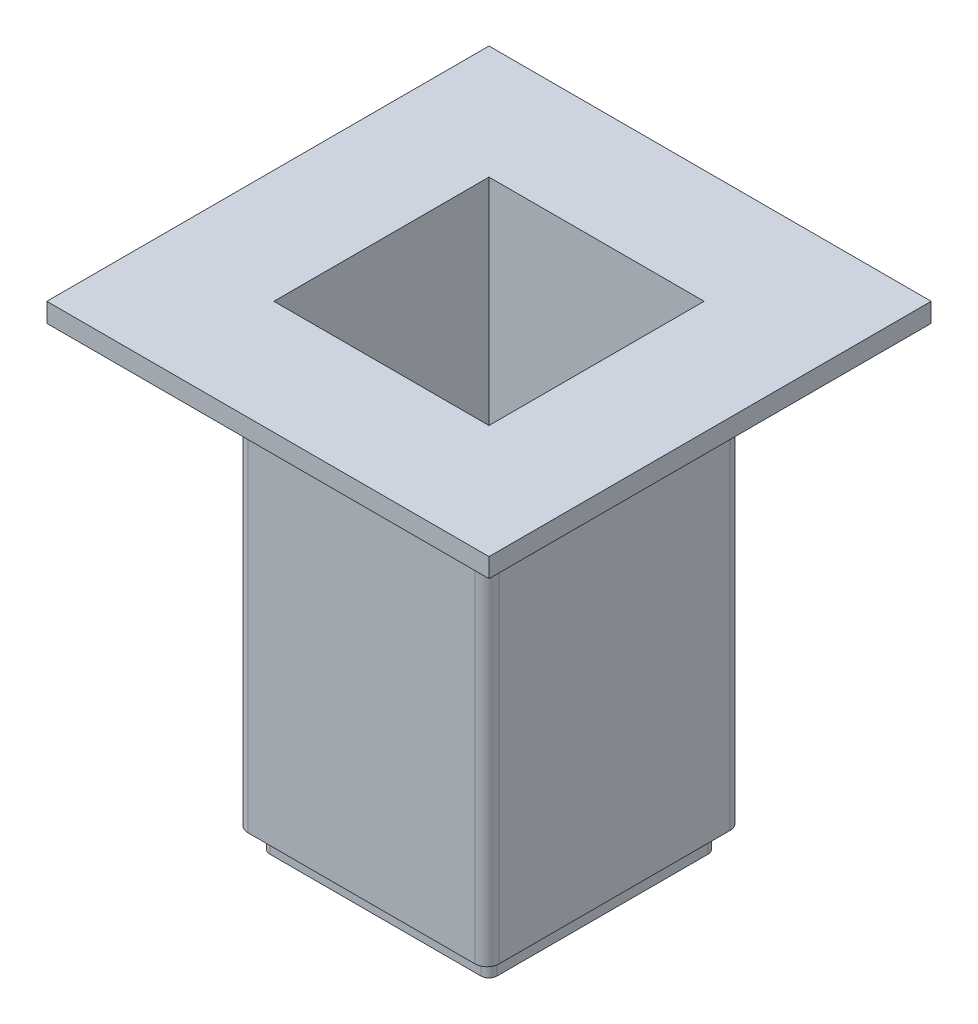
ISO-10303-21;
HEADER;
FILE_DESCRIPTION(('STEP AP214'),'2;1');
FILE_NAME('part.step','',(''),(''),'','','');
FILE_SCHEMA(('AUTOMOTIVE_DESIGN { 1 0 10303 214 1 1 1 1 }'));
ENDSEC;
DATA;
#1=APPLICATION_CONTEXT('core data for automotive mechanical design processes');
#2=APPLICATION_PROTOCOL_DEFINITION('international standard','automotive_design',2000,#1);
#3=PRODUCT_CONTEXT('',#1,'mechanical');
#4=PRODUCT('Part','Part','',(#3));
#5=PRODUCT_RELATED_PRODUCT_CATEGORY('part','',(#4));
#6=PRODUCT_DEFINITION_FORMATION('','',#4);
#7=PRODUCT_DEFINITION_CONTEXT('part definition',#1,'design');
#8=PRODUCT_DEFINITION('design','',#6,#7);
#9=PRODUCT_DEFINITION_SHAPE('','',#8);
#10=(LENGTH_UNIT() NAMED_UNIT(*) SI_UNIT(.MILLI.,.METRE.));
#11=(NAMED_UNIT(*) PLANE_ANGLE_UNIT() SI_UNIT($,.RADIAN.));
#12=(NAMED_UNIT(*) SI_UNIT($,.STERADIAN.) SOLID_ANGLE_UNIT());
#13=UNCERTAINTY_MEASURE_WITH_UNIT(LENGTH_MEASURE(1.E-05),#10,'distance_accuracy_value','');
#14=(GEOMETRIC_REPRESENTATION_CONTEXT(3) GLOBAL_UNCERTAINTY_ASSIGNED_CONTEXT((#13)) GLOBAL_UNIT_ASSIGNED_CONTEXT((#10,
#11,#12)) REPRESENTATION_CONTEXT('',''));
#15=CARTESIAN_POINT('',(0.,0.,0.));
#16=DIRECTION('',(0.,0.,1.));
#17=DIRECTION('',(1.,0.,0.));
#18=AXIS2_PLACEMENT_3D('',#15,#16,#17);
#19=CARTESIAN_POINT('',(16.,110.095640579559,16.));
#20=DIRECTION('',(0.,0.,1.));
#21=DIRECTION('',(1.,0.,0.));
#22=AXIS2_PLACEMENT_3D('',#19,#20,#21);
#23=PLANE('',#22);
#24=DIRECTION('',(0.,1.,0.));
#25=VECTOR('',#24,1.);
#26=CARTESIAN_POINT('',(-14.25,-39.35,16.));
#27=LINE('',#26,#25);
#28=CARTESIAN_POINT('',(-14.25,27.85,16.));
#29=VERTEX_POINT('',#28);
#30=CARTESIAN_POINT('',(-14.25,-26.65,16.));
#31=VERTEX_POINT('',#30);
#32=EDGE_CURVE('E283',#29,#31,#27,.F.);
#33=ORIENTED_EDGE('',*,*,#32,.T.);
#34=DIRECTION('',(1.,0.,0.));
#35=VECTOR('',#34,1.);
#36=CARTESIAN_POINT('',(-14.25,-26.65,16.));
#37=LINE('',#36,#35);
#38=CARTESIAN_POINT('',(14.25,-26.65,16.));
#39=VERTEX_POINT('',#38);
#40=EDGE_CURVE('E277',#31,#39,#37,.T.);
#41=ORIENTED_EDGE('',*,*,#40,.T.);
#42=DIRECTION('',(0.,1.,0.));
#43=VECTOR('',#42,1.);
#44=CARTESIAN_POINT('',(14.25,-39.35,16.));
#45=LINE('',#44,#43);
#46=CARTESIAN_POINT('',(14.25,27.85,16.));
#47=VERTEX_POINT('',#46);
#48=EDGE_CURVE('E280',#47,#39,#45,.F.);
#49=ORIENTED_EDGE('',*,*,#48,.F.);
#50=DIRECTION('',(1.,0.,0.));
#51=VECTOR('',#50,1.);
#52=CARTESIAN_POINT('',(16.,27.85,16.));
#53=LINE('',#52,#51);
#54=EDGE_CURVE('E308',#29,#47,#53,.T.);
#55=ORIENTED_EDGE('',*,*,#54,.F.);
#56=EDGE_LOOP('',(#33,#41,#49,#55));
#57=FACE_BOUND('',#56,.T.);
#58=ADVANCED_FACE('F116',(#57),#23,.T.);
#59=CARTESIAN_POINT('',(-16.,110.095640579559,-16.));
#60=DIRECTION('',(0.,0.,-1.));
#61=DIRECTION('',(-1.,0.,0.));
#62=AXIS2_PLACEMENT_3D('',#59,#60,#61);
#63=PLANE('',#62);
#64=DIRECTION('',(0.,1.,0.));
#65=VECTOR('',#64,1.);
#66=CARTESIAN_POINT('',(14.25,-39.35,-16.));
#67=LINE('',#66,#65);
#68=CARTESIAN_POINT('',(14.25,-26.65,-16.));
#69=VERTEX_POINT('',#68);
#70=CARTESIAN_POINT('',(14.25,27.85,-16.));
#71=VERTEX_POINT('',#70);
#72=EDGE_CURVE('E404',#69,#71,#67,.T.);
#73=ORIENTED_EDGE('',*,*,#72,.F.);
#74=DIRECTION('',(-1.,0.,0.));
#75=VECTOR('',#74,1.);
#76=CARTESIAN_POINT('',(-14.25,-26.65,-16.));
#77=LINE('',#76,#75);
#78=CARTESIAN_POINT('',(-14.25,-26.65,-16.));
#79=VERTEX_POINT('',#78);
#80=EDGE_CURVE('E460',#69,#79,#77,.T.);
#81=ORIENTED_EDGE('',*,*,#80,.T.);
#82=DIRECTION('',(0.,1.,0.));
#83=VECTOR('',#82,1.);
#84=CARTESIAN_POINT('',(-14.25,-39.35,-16.));
#85=LINE('',#84,#83);
#86=CARTESIAN_POINT('',(-14.25,27.85,-16.));
#87=VERTEX_POINT('',#86);
#88=EDGE_CURVE('E401',#79,#87,#85,.T.);
#89=ORIENTED_EDGE('',*,*,#88,.T.);
#90=DIRECTION('',(-1.,0.,0.));
#91=VECTOR('',#90,1.);
#92=CARTESIAN_POINT('',(-16.,27.85,-16.));
#93=LINE('',#92,#91);
#94=EDGE_CURVE('E304',#71,#87,#93,.T.);
#95=ORIENTED_EDGE('',*,*,#94,.F.);
#96=EDGE_LOOP('',(#73,#81,#89,#95));
#97=FACE_BOUND('',#96,.T.);
#98=ADVANCED_FACE('F506',(#97),#63,.T.);
#99=CARTESIAN_POINT('',(-12.75,-26.65,-16.));
#100=DIRECTION('',(0.,-1.,0.));
#101=DIRECTION('',(0.,0.,-1.));
#102=AXIS2_PLACEMENT_3D('',#99,#100,#101);
#103=PLANE('',#102);
#104=DIRECTION('',(-1.,0.,0.));
#105=VECTOR('',#104,1.);
#106=CARTESIAN_POINT('',(-14.25,-26.65,14.25));
#107=LINE('',#106,#105);
#108=CARTESIAN_POINT('',(13.25,-26.65,14.25));
#109=VERTEX_POINT('',#108);
#110=CARTESIAN_POINT('',(-13.25,-26.65,14.25));
#111=VERTEX_POINT('',#110);
#112=EDGE_CURVE('E288',#109,#111,#107,.T.);
#113=ORIENTED_EDGE('',*,*,#112,.F.);
#114=CARTESIAN_POINT('',(13.25,-26.65,13.25));
#115=DIRECTION('',(0.,-1.,0.));
#116=DIRECTION('',(0.,0.,-1.));
#117=AXIS2_PLACEMENT_3D('',#114,#115,#116);
#118=CIRCLE('',#117,1.);
#119=CARTESIAN_POINT('',(14.25,-26.65,13.25));
#120=VERTEX_POINT('',#119);
#121=EDGE_CURVE('E13',#109,#120,#118,.F.);
#122=ORIENTED_EDGE('',*,*,#121,.T.);
#123=DIRECTION('',(0.,0.,1.));
#124=VECTOR('',#123,1.);
#125=CARTESIAN_POINT('',(14.25,-26.65,-16.));
#126=LINE('',#125,#124);
#127=CARTESIAN_POINT('',(14.25,-26.65,-13.25));
#128=VERTEX_POINT('',#127);
#129=EDGE_CURVE('E353',#128,#120,#126,.T.);
#130=ORIENTED_EDGE('',*,*,#129,.F.);
#131=CARTESIAN_POINT('',(13.25,-26.65,-13.25));
#132=DIRECTION('',(0.,-1.,0.));
#133=DIRECTION('',(0.,0.,-1.));
#134=AXIS2_PLACEMENT_3D('',#131,#132,#133);
#135=CIRCLE('',#134,1.);
#136=CARTESIAN_POINT('',(13.25,-26.65,-14.25));
#137=VERTEX_POINT('',#136);
#138=EDGE_CURVE('E434',#128,#137,#135,.F.);
#139=ORIENTED_EDGE('',*,*,#138,.T.);
#140=DIRECTION('',(1.,0.,0.));
#141=VECTOR('',#140,1.);
#142=CARTESIAN_POINT('',(-14.25,-26.65,-14.25));
#143=LINE('',#142,#141);
#144=CARTESIAN_POINT('',(-13.25,-26.65,-14.25));
#145=VERTEX_POINT('',#144);
#146=EDGE_CURVE('E440',#145,#137,#143,.T.);
#147=ORIENTED_EDGE('',*,*,#146,.F.);
#148=CARTESIAN_POINT('',(-13.25,-26.65,-13.25));
#149=DIRECTION('',(0.,-1.,0.));
#150=DIRECTION('',(0.,0.,-1.));
#151=AXIS2_PLACEMENT_3D('',#148,#149,#150);
#152=CIRCLE('',#151,1.);
#153=CARTESIAN_POINT('',(-14.25,-26.65,-13.25));
#154=VERTEX_POINT('',#153);
#155=EDGE_CURVE('E436',#145,#154,#152,.F.);
#156=ORIENTED_EDGE('',*,*,#155,.T.);
#157=DIRECTION('',(0.,0.,-1.));
#158=VECTOR('',#157,1.);
#159=CARTESIAN_POINT('',(-14.25,-26.65,16.));
#160=LINE('',#159,#158);
#161=CARTESIAN_POINT('',(-14.25,-26.65,13.25));
#162=VERTEX_POINT('',#161);
#163=EDGE_CURVE('E356',#162,#154,#160,.T.);
#164=ORIENTED_EDGE('',*,*,#163,.F.);
#165=CARTESIAN_POINT('',(-13.25,-26.65,13.25));
#166=DIRECTION('',(0.,-1.,0.));
#167=DIRECTION('',(0.,0.,-1.));
#168=AXIS2_PLACEMENT_3D('',#165,#166,#167);
#169=CIRCLE('',#168,1.);
#170=EDGE_CURVE('E124',#162,#111,#169,.F.);
#171=ORIENTED_EDGE('',*,*,#170,.T.);
#172=EDGE_LOOP('',(#113,#122,#130,#139,#147,#156,#164,#171));
#173=FACE_BOUND('',#172,.T.);
#174=CARTESIAN_POINT('',(14.25,-26.65,14.5));
#175=DIRECTION('',(0.,-1.,0.));
#176=DIRECTION('',(0.,0.,-1.));
#177=AXIS2_PLACEMENT_3D('',#174,#175,#176);
#178=CIRCLE('',#177,1.5);
#179=CARTESIAN_POINT('',(15.75,-26.65,14.5));
#180=VERTEX_POINT('',#179);
#181=EDGE_CURVE('E293',#39,#180,#178,.F.);
#182=ORIENTED_EDGE('',*,*,#181,.F.);
#183=ORIENTED_EDGE('',*,*,#40,.F.);
#184=CARTESIAN_POINT('',(-14.25,-26.65,14.5));
#185=DIRECTION('',(0.,-1.,0.));
#186=DIRECTION('',(0.,0.,-1.));
#187=AXIS2_PLACEMENT_3D('',#184,#185,#186);
#188=CIRCLE('',#187,1.5);
#189=CARTESIAN_POINT('',(-15.75,-26.65,14.5));
#190=VERTEX_POINT('',#189);
#191=EDGE_CURVE('E305',#190,#31,#188,.F.);
#192=ORIENTED_EDGE('',*,*,#191,.F.);
#193=DIRECTION('',(0.,0.,-1.));
#194=VECTOR('',#193,1.);
#195=CARTESIAN_POINT('',(-15.75,-26.65,16.));
#196=LINE('',#195,#194);
#197=CARTESIAN_POINT('',(-15.75,-26.65,-14.5));
#198=VERTEX_POINT('',#197);
#199=EDGE_CURVE('E360',#190,#198,#196,.T.);
#200=ORIENTED_EDGE('',*,*,#199,.T.);
#201=CARTESIAN_POINT('',(-14.25,-26.65,-14.5));
#202=DIRECTION('',(0.,-1.,0.));
#203=DIRECTION('',(0.,0.,-1.));
#204=AXIS2_PLACEMENT_3D('',#201,#202,#203);
#205=CIRCLE('',#204,1.5);
#206=EDGE_CURVE('E476',#198,#79,#205,.T.);
#207=ORIENTED_EDGE('',*,*,#206,.T.);
#208=ORIENTED_EDGE('',*,*,#80,.F.);
#209=CARTESIAN_POINT('',(14.25,-26.65,-14.5));
#210=DIRECTION('',(0.,-1.,0.));
#211=DIRECTION('',(0.,0.,-1.));
#212=AXIS2_PLACEMENT_3D('',#209,#210,#211);
#213=CIRCLE('',#212,1.5);
#214=CARTESIAN_POINT('',(15.75,-26.65,-14.5));
#215=VERTEX_POINT('',#214);
#216=EDGE_CURVE('E310',#69,#215,#213,.T.);
#217=ORIENTED_EDGE('',*,*,#216,.T.);
#218=DIRECTION('',(0.,0.,1.));
#219=VECTOR('',#218,1.);
#220=CARTESIAN_POINT('',(15.75,-26.65,-16.));
#221=LINE('',#220,#219);
#222=EDGE_CURVE('E303',#215,#180,#221,.T.);
#223=ORIENTED_EDGE('',*,*,#222,.T.);
#224=EDGE_LOOP('',(#182,#183,#192,#200,#207,#208,#217,#223));
#225=FACE_BOUND('',#224,.T.);
#226=ADVANCED_FACE('F300',(#173,#225),#103,.T.);
#227=CARTESIAN_POINT('',(-15.75,-29.15,0.));
#228=DIRECTION('',(1.,0.,0.));
#229=DIRECTION('',(0.,0.,-1.));
#230=AXIS2_PLACEMENT_3D('',#227,#228,#229);
#231=PLANE('',#230);
#232=DIRECTION('',(0.,1.,0.));
#233=VECTOR('',#232,1.);
#234=CARTESIAN_POINT('',(-15.75,-39.35,14.5));
#235=LINE('',#234,#233);
#236=CARTESIAN_POINT('',(-15.75,27.85,14.5));
#237=VERTEX_POINT('',#236);
#238=EDGE_CURVE('E479',#190,#237,#235,.T.);
#239=ORIENTED_EDGE('',*,*,#238,.T.);
#240=DIRECTION('',(0.,0.,-1.));
#241=VECTOR('',#240,1.);
#242=CARTESIAN_POINT('',(-15.75,27.85,0.));
#243=LINE('',#242,#241);
#244=CARTESIAN_POINT('',(-15.75,27.85,-14.5));
#245=VERTEX_POINT('',#244);
#246=EDGE_CURVE('E366',#237,#245,#243,.T.);
#247=ORIENTED_EDGE('',*,*,#246,.T.);
#248=DIRECTION('',(0.,1.,0.));
#249=VECTOR('',#248,1.);
#250=CARTESIAN_POINT('',(-15.75,-39.35,-14.5));
#251=LINE('',#250,#249);
#252=EDGE_CURVE('E466',#198,#245,#251,.T.);
#253=ORIENTED_EDGE('',*,*,#252,.F.);
#254=ORIENTED_EDGE('',*,*,#199,.F.);
#255=EDGE_LOOP('',(#239,#247,#253,#254));
#256=FACE_BOUND('',#255,.T.);
#257=ADVANCED_FACE('F500',(#256),#231,.F.);
#258=CARTESIAN_POINT('',(12.75,-29.35,16.));
#259=DIRECTION('',(0.,-1.,0.));
#260=DIRECTION('',(0.,0.,-1.));
#261=AXIS2_PLACEMENT_3D('',#258,#259,#260);
#262=PLANE('',#261);
#263=DIRECTION('',(-1.,0.,0.));
#264=VECTOR('',#263,1.);
#265=CARTESIAN_POINT('',(-14.25,-29.35,-14.25));
#266=LINE('',#265,#264);
#267=CARTESIAN_POINT('',(13.25,-29.35,-14.25));
#268=VERTEX_POINT('',#267);
#269=CARTESIAN_POINT('',(-13.25,-29.35,-14.25));
#270=VERTEX_POINT('',#269);
#271=EDGE_CURVE('E454',#268,#270,#266,.T.);
#272=ORIENTED_EDGE('',*,*,#271,.F.);
#273=CARTESIAN_POINT('',(13.25,-29.35,-13.25));
#274=DIRECTION('',(0.,-1.,0.));
#275=DIRECTION('',(0.,0.,-1.));
#276=AXIS2_PLACEMENT_3D('',#273,#274,#275);
#277=CIRCLE('',#276,1.);
#278=CARTESIAN_POINT('',(14.25,-29.35,-13.25));
#279=VERTEX_POINT('',#278);
#280=EDGE_CURVE('E418',#268,#279,#277,.T.);
#281=ORIENTED_EDGE('',*,*,#280,.T.);
#282=DIRECTION('',(0.,0.,1.));
#283=VECTOR('',#282,1.);
#284=CARTESIAN_POINT('',(14.25,-29.35,-16.));
#285=LINE('',#284,#283);
#286=CARTESIAN_POINT('',(14.25,-29.35,13.25));
#287=VERTEX_POINT('',#286);
#288=EDGE_CURVE('E350',#279,#287,#285,.T.);
#289=ORIENTED_EDGE('',*,*,#288,.T.);
#290=CARTESIAN_POINT('',(13.25,-29.35,13.25));
#291=DIRECTION('',(0.,-1.,0.));
#292=DIRECTION('',(0.,0.,-1.));
#293=AXIS2_PLACEMENT_3D('',#290,#291,#292);
#294=CIRCLE('',#293,1.);
#295=CARTESIAN_POINT('',(13.25,-29.35,14.25));
#296=VERTEX_POINT('',#295);
#297=EDGE_CURVE('E412',#287,#296,#294,.T.);
#298=ORIENTED_EDGE('',*,*,#297,.T.);
#299=DIRECTION('',(1.,0.,0.));
#300=VECTOR('',#299,1.);
#301=CARTESIAN_POINT('',(-14.25,-29.35,14.25));
#302=LINE('',#301,#300);
#303=CARTESIAN_POINT('',(-13.25,-29.35,14.25));
#304=VERTEX_POINT('',#303);
#305=EDGE_CURVE('E289',#304,#296,#302,.T.);
#306=ORIENTED_EDGE('',*,*,#305,.F.);
#307=CARTESIAN_POINT('',(-13.25,-29.35,13.25));
#308=DIRECTION('',(0.,-1.,0.));
#309=DIRECTION('',(0.,0.,-1.));
#310=AXIS2_PLACEMENT_3D('',#307,#308,#309);
#311=CIRCLE('',#310,1.);
#312=CARTESIAN_POINT('',(-14.25,-29.35,13.25));
#313=VERTEX_POINT('',#312);
#314=EDGE_CURVE('E414',#304,#313,#311,.T.);
#315=ORIENTED_EDGE('',*,*,#314,.T.);
#316=DIRECTION('',(0.,0.,-1.));
#317=VECTOR('',#316,1.);
#318=CARTESIAN_POINT('',(-14.25,-29.35,16.));
#319=LINE('',#318,#317);
#320=CARTESIAN_POINT('',(-14.25,-29.35,-13.25));
#321=VERTEX_POINT('',#320);
#322=EDGE_CURVE('E341',#313,#321,#319,.T.);
#323=ORIENTED_EDGE('',*,*,#322,.T.);
#324=CARTESIAN_POINT('',(-13.25,-29.35,-13.25));
#325=DIRECTION('',(0.,-1.,0.));
#326=DIRECTION('',(0.,0.,-1.));
#327=AXIS2_PLACEMENT_3D('',#324,#325,#326);
#328=CIRCLE('',#327,1.);
#329=EDGE_CURVE('E416',#321,#270,#328,.T.);
#330=ORIENTED_EDGE('',*,*,#329,.T.);
#331=EDGE_LOOP('',(#272,#281,#289,#298,#306,#315,#323,#330));
#332=FACE_BOUND('',#331,.T.);
#333=DIRECTION('',(-1.,0.,0.));
#334=VECTOR('',#333,1.);
#335=CARTESIAN_POINT('',(13.5,-29.35,-13.5));
#336=LINE('',#335,#334);
#337=CARTESIAN_POINT('',(13.5,-29.35,-13.5));
#338=VERTEX_POINT('',#337);
#339=CARTESIAN_POINT('',(-13.5,-29.35,-13.5));
#340=VERTEX_POINT('',#339);
#341=EDGE_CURVE('E328',#338,#340,#336,.T.);
#342=ORIENTED_EDGE('',*,*,#341,.T.);
#343=DIRECTION('',(0.,0.,1.));
#344=VECTOR('',#343,1.);
#345=CARTESIAN_POINT('',(-13.5,-29.35,13.5));
#346=LINE('',#345,#344);
#347=CARTESIAN_POINT('',(-13.5,-29.35,13.5));
#348=VERTEX_POINT('',#347);
#349=EDGE_CURVE('E332',#340,#348,#346,.T.);
#350=ORIENTED_EDGE('',*,*,#349,.T.);
#351=DIRECTION('',(1.,0.,0.));
#352=VECTOR('',#351,1.);
#353=CARTESIAN_POINT('',(13.5,-29.35,13.5));
#354=LINE('',#353,#352);
#355=CARTESIAN_POINT('',(13.5,-29.35,13.5));
#356=VERTEX_POINT('',#355);
#357=EDGE_CURVE('E335',#348,#356,#354,.T.);
#358=ORIENTED_EDGE('',*,*,#357,.T.);
#359=DIRECTION('',(0.,0.,-1.));
#360=VECTOR('',#359,1.);
#361=CARTESIAN_POINT('',(13.5,-29.35,13.5));
#362=LINE('',#361,#360);
#363=EDGE_CURVE('E338',#356,#338,#362,.T.);
#364=ORIENTED_EDGE('',*,*,#363,.T.);
#365=EDGE_LOOP('',(#342,#350,#358,#364));
#366=FACE_BOUND('',#365,.T.);
#367=ADVANCED_FACE('F452',(#332,#366),#262,.T.);
#368=CARTESIAN_POINT('',(14.25,27.85,17.5));
#369=DIRECTION('',(-1.,0.,0.));
#370=DIRECTION('',(0.,0.,1.));
#371=AXIS2_PLACEMENT_3D('',#368,#369,#370);
#372=PLANE('',#371);
#373=ORIENTED_EDGE('',*,*,#288,.F.);
#374=DIRECTION('',(0.,-1.,0.));
#375=VECTOR('',#374,1.);
#376=CARTESIAN_POINT('',(14.25,27.85,-13.25));
#377=LINE('',#376,#375);
#378=EDGE_CURVE('E423',#279,#128,#377,.F.);
#379=ORIENTED_EDGE('',*,*,#378,.T.);
#380=ORIENTED_EDGE('',*,*,#129,.T.);
#381=DIRECTION('',(0.,-1.,0.));
#382=VECTOR('',#381,1.);
#383=CARTESIAN_POINT('',(14.25,27.85,13.25));
#384=LINE('',#383,#382);
#385=EDGE_CURVE('E420',#120,#287,#384,.T.);
#386=ORIENTED_EDGE('',*,*,#385,.T.);
#387=EDGE_LOOP('',(#373,#379,#380,#386));
#388=FACE_BOUND('',#387,.T.);
#389=ADVANCED_FACE('F542',(#388),#372,.F.);
#390=CARTESIAN_POINT('',(-14.25,27.85,17.5));
#391=DIRECTION('',(1.,0.,0.));
#392=DIRECTION('',(0.,0.,-1.));
#393=AXIS2_PLACEMENT_3D('',#390,#391,#392);
#394=PLANE('',#393);
#395=ORIENTED_EDGE('',*,*,#163,.T.);
#396=DIRECTION('',(0.,-1.,0.));
#397=VECTOR('',#396,1.);
#398=CARTESIAN_POINT('',(-14.25,27.85,-13.25));
#399=LINE('',#398,#397);
#400=EDGE_CURVE('E427',#154,#321,#399,.T.);
#401=ORIENTED_EDGE('',*,*,#400,.T.);
#402=ORIENTED_EDGE('',*,*,#322,.F.);
#403=DIRECTION('',(0.,-1.,0.));
#404=VECTOR('',#403,1.);
#405=CARTESIAN_POINT('',(-14.25,27.85,13.25));
#406=LINE('',#405,#404);
#407=EDGE_CURVE('E425',#313,#162,#406,.F.);
#408=ORIENTED_EDGE('',*,*,#407,.T.);
#409=EDGE_LOOP('',(#395,#401,#402,#408));
#410=FACE_BOUND('',#409,.T.);
#411=ADVANCED_FACE('F445',(#410),#394,.F.);
#412=CARTESIAN_POINT('',(15.75,-29.15,0.));
#413=DIRECTION('',(-1.,0.,0.));
#414=DIRECTION('',(0.,0.,1.));
#415=AXIS2_PLACEMENT_3D('',#412,#413,#414);
#416=PLANE('',#415);
#417=ORIENTED_EDGE('',*,*,#222,.F.);
#418=DIRECTION('',(0.,1.,0.));
#419=VECTOR('',#418,1.);
#420=CARTESIAN_POINT('',(15.75,-39.35,-14.5));
#421=LINE('',#420,#419);
#422=CARTESIAN_POINT('',(15.75,27.85,-14.5));
#423=VERTEX_POINT('',#422);
#424=EDGE_CURVE('E473',#215,#423,#421,.T.);
#425=ORIENTED_EDGE('',*,*,#424,.T.);
#426=DIRECTION('',(0.,0.,1.));
#427=VECTOR('',#426,1.);
#428=CARTESIAN_POINT('',(15.75,27.85,0.));
#429=LINE('',#428,#427);
#430=CARTESIAN_POINT('',(15.75,27.85,14.5));
#431=VERTEX_POINT('',#430);
#432=EDGE_CURVE('E363',#423,#431,#429,.T.);
#433=ORIENTED_EDGE('',*,*,#432,.T.);
#434=DIRECTION('',(0.,1.,0.));
#435=VECTOR('',#434,1.);
#436=CARTESIAN_POINT('',(15.75,-39.35,14.5));
#437=LINE('',#436,#435);
#438=EDGE_CURVE('E477',#180,#431,#437,.T.);
#439=ORIENTED_EDGE('',*,*,#438,.F.);
#440=EDGE_LOOP('',(#417,#425,#433,#439));
#441=FACE_BOUND('',#440,.T.);
#442=ADVANCED_FACE('F488',(#441),#416,.F.);
#443=CARTESIAN_POINT('',(0.,30.25,0.));
#444=DIRECTION('',(0.,-1.,0.));
#445=DIRECTION('',(0.,0.,-1.));
#446=AXIS2_PLACEMENT_3D('',#443,#444,#445);
#447=PLANE('',#446);
#448=DIRECTION('',(0.,0.,1.));
#449=VECTOR('',#448,1.);
#450=CARTESIAN_POINT('',(-27.75,30.25,0.));
#451=LINE('',#450,#449);
#452=CARTESIAN_POINT('',(-27.75,30.25,-27.75));
#453=VERTEX_POINT('',#452);
#454=CARTESIAN_POINT('',(-27.75,30.25,27.75));
#455=VERTEX_POINT('',#454);
#456=EDGE_CURVE('E373',#453,#455,#451,.T.);
#457=ORIENTED_EDGE('',*,*,#456,.T.);
#458=DIRECTION('',(1.,0.,0.));
#459=VECTOR('',#458,1.);
#460=CARTESIAN_POINT('',(-28.75,30.25,27.75));
#461=LINE('',#460,#459);
#462=CARTESIAN_POINT('',(27.75,30.25,27.75));
#463=VERTEX_POINT('',#462);
#464=EDGE_CURVE('E379',#455,#463,#461,.T.);
#465=ORIENTED_EDGE('',*,*,#464,.T.);
#466=DIRECTION('',(0.,0.,-1.));
#467=VECTOR('',#466,1.);
#468=CARTESIAN_POINT('',(27.75,30.25,0.));
#469=LINE('',#468,#467);
#470=CARTESIAN_POINT('',(27.75,30.25,-27.75));
#471=VERTEX_POINT('',#470);
#472=EDGE_CURVE('E383',#463,#471,#469,.T.);
#473=ORIENTED_EDGE('',*,*,#472,.T.);
#474=DIRECTION('',(-1.,0.,0.));
#475=VECTOR('',#474,1.);
#476=CARTESIAN_POINT('',(-28.75,30.25,-27.75));
#477=LINE('',#476,#475);
#478=EDGE_CURVE('E386',#471,#453,#477,.T.);
#479=ORIENTED_EDGE('',*,*,#478,.T.);
#480=EDGE_LOOP('',(#457,#465,#473,#479));
#481=FACE_BOUND('',#480,.T.);
#482=DIRECTION('',(0.,0.,1.));
#483=VECTOR('',#482,1.);
#484=CARTESIAN_POINT('',(-13.5,30.25,13.5));
#485=LINE('',#484,#483);
#486=CARTESIAN_POINT('',(-13.5,30.25,-13.5));
#487=VERTEX_POINT('',#486);
#488=CARTESIAN_POINT('',(-13.5,30.25,13.5));
#489=VERTEX_POINT('',#488);
#490=EDGE_CURVE('E329',#487,#489,#485,.T.);
#491=ORIENTED_EDGE('',*,*,#490,.F.);
#492=DIRECTION('',(-1.,0.,0.));
#493=VECTOR('',#492,1.);
#494=CARTESIAN_POINT('',(13.5,30.25,-13.5));
#495=LINE('',#494,#493);
#496=CARTESIAN_POINT('',(13.5,30.25,-13.5));
#497=VERTEX_POINT('',#496);
#498=EDGE_CURVE('E316',#497,#487,#495,.T.);
#499=ORIENTED_EDGE('',*,*,#498,.F.);
#500=DIRECTION('',(0.,0.,-1.));
#501=VECTOR('',#500,1.);
#502=CARTESIAN_POINT('',(13.5,30.25,13.5));
#503=LINE('',#502,#501);
#504=CARTESIAN_POINT('',(13.5,30.25,13.5));
#505=VERTEX_POINT('',#504);
#506=EDGE_CURVE('E321',#505,#497,#503,.T.);
#507=ORIENTED_EDGE('',*,*,#506,.F.);
#508=DIRECTION('',(1.,0.,0.));
#509=VECTOR('',#508,1.);
#510=CARTESIAN_POINT('',(13.5,30.25,13.5));
#511=LINE('',#510,#509);
#512=EDGE_CURVE('E325',#489,#505,#511,.T.);
#513=ORIENTED_EDGE('',*,*,#512,.F.);
#514=EDGE_LOOP('',(#491,#499,#507,#513));
#515=FACE_BOUND('',#514,.T.);
#516=ADVANCED_FACE('F549',(#481,#515),#447,.F.);
#517=CARTESIAN_POINT('',(0.,27.85,0.));
#518=DIRECTION('',(0.,-1.,0.));
#519=DIRECTION('',(0.,0.,-1.));
#520=AXIS2_PLACEMENT_3D('',#517,#518,#519);
#521=PLANE('',#520);
#522=ORIENTED_EDGE('',*,*,#432,.F.);
#523=CARTESIAN_POINT('',(14.25,27.85,-14.5));
#524=DIRECTION('',(0.,-1.,0.));
#525=DIRECTION('',(0.,0.,-1.));
#526=AXIS2_PLACEMENT_3D('',#523,#524,#525);
#527=CIRCLE('',#526,1.5);
#528=EDGE_CURVE('E471',#71,#423,#527,.T.);
#529=ORIENTED_EDGE('',*,*,#528,.F.);
#530=ORIENTED_EDGE('',*,*,#94,.T.);
#531=CARTESIAN_POINT('',(-14.25,27.85,-14.5));
#532=DIRECTION('',(0.,-1.,0.));
#533=DIRECTION('',(0.,0.,-1.));
#534=AXIS2_PLACEMENT_3D('',#531,#532,#533);
#535=CIRCLE('',#534,1.5);
#536=EDGE_CURVE('E469',#245,#87,#535,.T.);
#537=ORIENTED_EDGE('',*,*,#536,.F.);
#538=ORIENTED_EDGE('',*,*,#246,.F.);
#539=CARTESIAN_POINT('',(-14.25,27.85,14.5));
#540=DIRECTION('',(0.,-1.,0.));
#541=DIRECTION('',(0.,0.,-1.));
#542=AXIS2_PLACEMENT_3D('',#539,#540,#541);
#543=CIRCLE('',#542,1.5);
#544=EDGE_CURVE('E467',#237,#29,#543,.F.);
#545=ORIENTED_EDGE('',*,*,#544,.T.);
#546=ORIENTED_EDGE('',*,*,#54,.T.);
#547=CARTESIAN_POINT('',(14.25,27.85,14.5));
#548=DIRECTION('',(0.,-1.,0.));
#549=DIRECTION('',(0.,0.,-1.));
#550=AXIS2_PLACEMENT_3D('',#547,#548,#549);
#551=CIRCLE('',#550,1.5);
#552=EDGE_CURVE('E296',#47,#431,#551,.F.);
#553=ORIENTED_EDGE('',*,*,#552,.T.);
#554=EDGE_LOOP('',(#522,#529,#530,#537,#538,#545,#546,#553));
#555=FACE_BOUND('',#554,.T.);
#556=DIRECTION('',(1.,0.,0.));
#557=VECTOR('',#556,1.);
#558=CARTESIAN_POINT('',(-28.75,27.85,27.75));
#559=LINE('',#558,#557);
#560=CARTESIAN_POINT('',(-27.75,27.85,27.75));
#561=VERTEX_POINT('',#560);
#562=CARTESIAN_POINT('',(27.75,27.85,27.75));
#563=VERTEX_POINT('',#562);
#564=EDGE_CURVE('E376',#561,#563,#559,.T.);
#565=ORIENTED_EDGE('',*,*,#564,.F.);
#566=DIRECTION('',(0.,0.,1.));
#567=VECTOR('',#566,1.);
#568=CARTESIAN_POINT('',(-27.75,27.85,0.));
#569=LINE('',#568,#567);
#570=CARTESIAN_POINT('',(-27.75,27.85,-27.75));
#571=VERTEX_POINT('',#570);
#572=EDGE_CURVE('E389',#571,#561,#569,.T.);
#573=ORIENTED_EDGE('',*,*,#572,.F.);
#574=DIRECTION('',(-1.,0.,0.));
#575=VECTOR('',#574,1.);
#576=CARTESIAN_POINT('',(-28.75,27.85,-27.75));
#577=LINE('',#576,#575);
#578=CARTESIAN_POINT('',(27.75,27.85,-27.75));
#579=VERTEX_POINT('',#578);
#580=EDGE_CURVE('E380',#579,#571,#577,.T.);
#581=ORIENTED_EDGE('',*,*,#580,.F.);
#582=DIRECTION('',(0.,0.,-1.));
#583=VECTOR('',#582,1.);
#584=CARTESIAN_POINT('',(27.75,27.85,0.));
#585=LINE('',#584,#583);
#586=EDGE_CURVE('E391',#563,#579,#585,.T.);
#587=ORIENTED_EDGE('',*,*,#586,.F.);
#588=EDGE_LOOP('',(#565,#573,#581,#587));
#589=FACE_BOUND('',#588,.T.);
#590=ADVANCED_FACE('F491',(#555,#589),#521,.T.);
#591=CARTESIAN_POINT('',(-28.75,30.25,-27.75));
#592=DIRECTION('',(0.,0.,1.));
#593=DIRECTION('',(1.,0.,0.));
#594=AXIS2_PLACEMENT_3D('',#591,#592,#593);
#595=PLANE('',#594);
#596=DIRECTION('',(0.,1.,0.));
#597=VECTOR('',#596,1.);
#598=CARTESIAN_POINT('',(-27.75,-29.35,-27.75));
#599=LINE('',#598,#597);
#600=EDGE_CURVE('E370',#571,#453,#599,.T.);
#601=ORIENTED_EDGE('',*,*,#600,.T.);
#602=ORIENTED_EDGE('',*,*,#478,.F.);
#603=DIRECTION('',(0.,1.,0.));
#604=VECTOR('',#603,1.);
#605=CARTESIAN_POINT('',(27.75,-29.35,-27.75));
#606=LINE('',#605,#604);
#607=EDGE_CURVE('E369',#579,#471,#606,.T.);
#608=ORIENTED_EDGE('',*,*,#607,.F.);
#609=ORIENTED_EDGE('',*,*,#580,.T.);
#610=EDGE_LOOP('',(#601,#602,#608,#609));
#611=FACE_BOUND('',#610,.T.);
#612=ADVANCED_FACE('F555',(#611),#595,.F.);
#613=CARTESIAN_POINT('',(-28.75,30.25,27.75));
#614=DIRECTION('',(0.,0.,-1.));
#615=DIRECTION('',(-1.,0.,0.));
#616=AXIS2_PLACEMENT_3D('',#613,#614,#615);
#617=PLANE('',#616);
#618=DIRECTION('',(0.,1.,0.));
#619=VECTOR('',#618,1.);
#620=CARTESIAN_POINT('',(-27.75,30.25,27.75));
#621=LINE('',#620,#619);
#622=EDGE_CURVE('E398',#561,#455,#621,.T.);
#623=ORIENTED_EDGE('',*,*,#622,.F.);
#624=ORIENTED_EDGE('',*,*,#564,.T.);
#625=DIRECTION('',(0.,-1.,0.));
#626=VECTOR('',#625,1.);
#627=CARTESIAN_POINT('',(27.75,30.25,27.75));
#628=LINE('',#627,#626);
#629=EDGE_CURVE('E393',#463,#563,#628,.T.);
#630=ORIENTED_EDGE('',*,*,#629,.F.);
#631=ORIENTED_EDGE('',*,*,#464,.F.);
#632=EDGE_LOOP('',(#623,#624,#630,#631));
#633=FACE_BOUND('',#632,.T.);
#634=ADVANCED_FACE('F558',(#633),#617,.F.);
#635=CARTESIAN_POINT('',(-27.75,31.95,16.5));
#636=DIRECTION('',(1.,0.,0.));
#637=DIRECTION('',(0.,0.,-1.));
#638=AXIS2_PLACEMENT_3D('',#635,#636,#637);
#639=PLANE('',#638);
#640=ORIENTED_EDGE('',*,*,#456,.F.);
#641=ORIENTED_EDGE('',*,*,#600,.F.);
#642=ORIENTED_EDGE('',*,*,#572,.T.);
#643=ORIENTED_EDGE('',*,*,#622,.T.);
#644=EDGE_LOOP('',(#640,#641,#642,#643));
#645=FACE_BOUND('',#644,.T.);
#646=ADVANCED_FACE('F562',(#645),#639,.F.);
#647=CARTESIAN_POINT('',(27.75,31.95,16.5));
#648=DIRECTION('',(-1.,0.,0.));
#649=DIRECTION('',(0.,0.,1.));
#650=AXIS2_PLACEMENT_3D('',#647,#648,#649);
#651=PLANE('',#650);
#652=ORIENTED_EDGE('',*,*,#472,.F.);
#653=ORIENTED_EDGE('',*,*,#629,.T.);
#654=ORIENTED_EDGE('',*,*,#586,.T.);
#655=ORIENTED_EDGE('',*,*,#607,.T.);
#656=EDGE_LOOP('',(#652,#653,#654,#655));
#657=FACE_BOUND('',#656,.T.);
#658=ADVANCED_FACE('F538',(#657),#651,.F.);
#659=CARTESIAN_POINT('',(-13.5,-72.3063732174866,13.5));
#660=DIRECTION('',(-1.,0.,0.));
#661=DIRECTION('',(0.,0.,1.));
#662=AXIS2_PLACEMENT_3D('',#659,#660,#661);
#663=PLANE('',#662);
#664=ORIENTED_EDGE('',*,*,#349,.F.);
#665=DIRECTION('',(0.,1.,0.));
#666=VECTOR('',#665,1.);
#667=CARTESIAN_POINT('',(-13.5,-72.3063732174866,-13.5));
#668=LINE('',#667,#666);
#669=EDGE_CURVE('E314',#340,#487,#668,.T.);
#670=ORIENTED_EDGE('',*,*,#669,.T.);
#671=ORIENTED_EDGE('',*,*,#490,.T.);
#672=DIRECTION('',(0.,1.,0.));
#673=VECTOR('',#672,1.);
#674=CARTESIAN_POINT('',(-13.5,-72.3063732174866,13.5));
#675=LINE('',#674,#673);
#676=EDGE_CURVE('E324',#348,#489,#675,.T.);
#677=ORIENTED_EDGE('',*,*,#676,.F.);
#678=EDGE_LOOP('',(#664,#670,#671,#677));
#679=FACE_BOUND('',#678,.T.);
#680=ADVANCED_FACE('F534',(#679),#663,.F.);
#681=CARTESIAN_POINT('',(13.5,-72.3063732174866,-13.5));
#682=DIRECTION('',(0.,0.,-1.));
#683=DIRECTION('',(-1.,0.,0.));
#684=AXIS2_PLACEMENT_3D('',#681,#682,#683);
#685=PLANE('',#684);
#686=ORIENTED_EDGE('',*,*,#341,.F.);
#687=DIRECTION('',(0.,1.,0.));
#688=VECTOR('',#687,1.);
#689=CARTESIAN_POINT('',(13.5,-72.3063732174866,-13.5));
#690=LINE('',#689,#688);
#691=EDGE_CURVE('E320',#338,#497,#690,.T.);
#692=ORIENTED_EDGE('',*,*,#691,.T.);
#693=ORIENTED_EDGE('',*,*,#498,.T.);
#694=ORIENTED_EDGE('',*,*,#669,.F.);
#695=EDGE_LOOP('',(#686,#692,#693,#694));
#696=FACE_BOUND('',#695,.T.);
#697=ADVANCED_FACE('F530',(#696),#685,.F.);
#698=CARTESIAN_POINT('',(13.5,-72.3063732174866,13.5));
#699=DIRECTION('',(1.,0.,0.));
#700=DIRECTION('',(0.,0.,-1.));
#701=AXIS2_PLACEMENT_3D('',#698,#699,#700);
#702=PLANE('',#701);
#703=ORIENTED_EDGE('',*,*,#363,.F.);
#704=DIRECTION('',(0.,1.,0.));
#705=VECTOR('',#704,1.);
#706=CARTESIAN_POINT('',(13.5,-72.3063732174866,13.5));
#707=LINE('',#706,#705);
#708=EDGE_CURVE('E319',#356,#505,#707,.T.);
#709=ORIENTED_EDGE('',*,*,#708,.T.);
#710=ORIENTED_EDGE('',*,*,#506,.T.);
#711=ORIENTED_EDGE('',*,*,#691,.F.);
#712=EDGE_LOOP('',(#703,#709,#710,#711));
#713=FACE_BOUND('',#712,.T.);
#714=ADVANCED_FACE('F526',(#713),#702,.F.);
#715=CARTESIAN_POINT('',(13.5,-72.3063732174866,13.5));
#716=DIRECTION('',(0.,0.,1.));
#717=DIRECTION('',(1.,0.,0.));
#718=AXIS2_PLACEMENT_3D('',#715,#716,#717);
#719=PLANE('',#718);
#720=ORIENTED_EDGE('',*,*,#357,.F.);
#721=ORIENTED_EDGE('',*,*,#676,.T.);
#722=ORIENTED_EDGE('',*,*,#512,.T.);
#723=ORIENTED_EDGE('',*,*,#708,.F.);
#724=EDGE_LOOP('',(#720,#721,#722,#723));
#725=FACE_BOUND('',#724,.T.);
#726=ADVANCED_FACE('F515',(#725),#719,.F.);
#727=CARTESIAN_POINT('',(-14.25,-39.35,-14.5));
#728=DIRECTION('',(0.,1.,0.));
#729=DIRECTION('',(0.,0.,1.));
#730=AXIS2_PLACEMENT_3D('',#727,#728,#729);
#731=CYLINDRICAL_SURFACE('',#730,1.5);
#732=ORIENTED_EDGE('',*,*,#252,.T.);
#733=ORIENTED_EDGE('',*,*,#536,.T.);
#734=ORIENTED_EDGE('',*,*,#88,.F.);
#735=ORIENTED_EDGE('',*,*,#206,.F.);
#736=EDGE_LOOP('',(#732,#733,#734,#735));
#737=FACE_BOUND('',#736,.T.);
#738=ADVANCED_FACE('F502',(#737),#731,.T.);
#739=CARTESIAN_POINT('',(14.25,-39.35,-14.5));
#740=DIRECTION('',(0.,1.,0.));
#741=DIRECTION('',(0.,0.,1.));
#742=AXIS2_PLACEMENT_3D('',#739,#740,#741);
#743=CYLINDRICAL_SURFACE('',#742,1.5);
#744=ORIENTED_EDGE('',*,*,#72,.T.);
#745=ORIENTED_EDGE('',*,*,#528,.T.);
#746=ORIENTED_EDGE('',*,*,#424,.F.);
#747=ORIENTED_EDGE('',*,*,#216,.F.);
#748=EDGE_LOOP('',(#744,#745,#746,#747));
#749=FACE_BOUND('',#748,.T.);
#750=ADVANCED_FACE('F507',(#749),#743,.T.);
#751=CARTESIAN_POINT('',(14.25,-39.35,14.5));
#752=DIRECTION('',(0.,1.,0.));
#753=DIRECTION('',(0.,0.,1.));
#754=AXIS2_PLACEMENT_3D('',#751,#752,#753);
#755=CYLINDRICAL_SURFACE('',#754,1.5);
#756=ORIENTED_EDGE('',*,*,#181,.T.);
#757=ORIENTED_EDGE('',*,*,#438,.T.);
#758=ORIENTED_EDGE('',*,*,#552,.F.);
#759=ORIENTED_EDGE('',*,*,#48,.T.);
#760=EDGE_LOOP('',(#756,#757,#758,#759));
#761=FACE_BOUND('',#760,.T.);
#762=ADVANCED_FACE('F292',(#761),#755,.T.);
#763=CARTESIAN_POINT('',(-14.25,-39.35,14.5));
#764=DIRECTION('',(0.,1.,0.));
#765=DIRECTION('',(0.,0.,1.));
#766=AXIS2_PLACEMENT_3D('',#763,#764,#765);
#767=CYLINDRICAL_SURFACE('',#766,1.5);
#768=ORIENTED_EDGE('',*,*,#191,.T.);
#769=ORIENTED_EDGE('',*,*,#32,.F.);
#770=ORIENTED_EDGE('',*,*,#544,.F.);
#771=ORIENTED_EDGE('',*,*,#238,.F.);
#772=EDGE_LOOP('',(#768,#769,#770,#771));
#773=FACE_BOUND('',#772,.T.);
#774=ADVANCED_FACE('F496',(#773),#767,.T.);
#775=CARTESIAN_POINT('',(-14.25,1.90367752146823,-14.25));
#776=DIRECTION('',(0.,0.,1.));
#777=DIRECTION('',(1.,0.,0.));
#778=AXIS2_PLACEMENT_3D('',#775,#776,#777);
#779=PLANE('',#778);
#780=ORIENTED_EDGE('',*,*,#146,.T.);
#781=DIRECTION('',(0.,-1.,0.));
#782=VECTOR('',#781,1.);
#783=CARTESIAN_POINT('',(13.25,1.90367752146823,-14.25));
#784=LINE('',#783,#782);
#785=EDGE_CURVE('E409',#137,#268,#784,.T.);
#786=ORIENTED_EDGE('',*,*,#785,.T.);
#787=ORIENTED_EDGE('',*,*,#271,.T.);
#788=DIRECTION('',(0.,-1.,0.));
#789=VECTOR('',#788,1.);
#790=CARTESIAN_POINT('',(-13.25,1.90367752146823,-14.25));
#791=LINE('',#790,#789);
#792=EDGE_CURVE('E297',#270,#145,#791,.F.);
#793=ORIENTED_EDGE('',*,*,#792,.T.);
#794=EDGE_LOOP('',(#780,#786,#787,#793));
#795=FACE_BOUND('',#794,.T.);
#796=ADVANCED_FACE('F456',(#795),#779,.F.);
#797=CARTESIAN_POINT('',(-14.25,1.90367752146823,14.25));
#798=DIRECTION('',(0.,0.,-1.));
#799=DIRECTION('',(-1.,0.,0.));
#800=AXIS2_PLACEMENT_3D('',#797,#798,#799);
#801=PLANE('',#800);
#802=ORIENTED_EDGE('',*,*,#112,.T.);
#803=DIRECTION('',(0.,-1.,0.));
#804=VECTOR('',#803,1.);
#805=CARTESIAN_POINT('',(-13.25,1.90367752146823,14.25));
#806=LINE('',#805,#804);
#807=EDGE_CURVE('E431',#111,#304,#806,.T.);
#808=ORIENTED_EDGE('',*,*,#807,.T.);
#809=ORIENTED_EDGE('',*,*,#305,.T.);
#810=DIRECTION('',(0.,-1.,0.));
#811=VECTOR('',#810,1.);
#812=CARTESIAN_POINT('',(13.25,1.90367752146823,14.25));
#813=LINE('',#812,#811);
#814=EDGE_CURVE('E137',#296,#109,#813,.F.);
#815=ORIENTED_EDGE('',*,*,#814,.T.);
#816=EDGE_LOOP('',(#802,#808,#809,#815));
#817=FACE_BOUND('',#816,.T.);
#818=ADVANCED_FACE('F578',(#817),#801,.F.);
#819=CARTESIAN_POINT('',(13.25,1.90367752146823,-13.25));
#820=DIRECTION('',(0.,-1.,0.));
#821=DIRECTION('',(0.,0.,-1.));
#822=AXIS2_PLACEMENT_3D('',#819,#820,#821);
#823=CYLINDRICAL_SURFACE('',#822,1.);
#824=ORIENTED_EDGE('',*,*,#138,.F.);
#825=ORIENTED_EDGE('',*,*,#378,.F.);
#826=ORIENTED_EDGE('',*,*,#280,.F.);
#827=ORIENTED_EDGE('',*,*,#785,.F.);
#828=EDGE_LOOP('',(#824,#825,#826,#827));
#829=FACE_BOUND('',#828,.T.);
#830=ADVANCED_FACE('F575',(#829),#823,.T.);
#831=CARTESIAN_POINT('',(-13.25,27.85,-13.25));
#832=DIRECTION('',(0.,-1.,0.));
#833=DIRECTION('',(0.,0.,-1.));
#834=AXIS2_PLACEMENT_3D('',#831,#832,#833);
#835=CYLINDRICAL_SURFACE('',#834,1.);
#836=ORIENTED_EDGE('',*,*,#155,.F.);
#837=ORIENTED_EDGE('',*,*,#792,.F.);
#838=ORIENTED_EDGE('',*,*,#329,.F.);
#839=ORIENTED_EDGE('',*,*,#400,.F.);
#840=EDGE_LOOP('',(#836,#837,#838,#839));
#841=FACE_BOUND('',#840,.T.);
#842=ADVANCED_FACE('F448',(#841),#835,.T.);
#843=CARTESIAN_POINT('',(-13.25,1.90367752146823,13.25));
#844=DIRECTION('',(0.,-1.,0.));
#845=DIRECTION('',(0.,0.,-1.));
#846=AXIS2_PLACEMENT_3D('',#843,#844,#845);
#847=CYLINDRICAL_SURFACE('',#846,1.);
#848=ORIENTED_EDGE('',*,*,#170,.F.);
#849=ORIENTED_EDGE('',*,*,#407,.F.);
#850=ORIENTED_EDGE('',*,*,#314,.F.);
#851=ORIENTED_EDGE('',*,*,#807,.F.);
#852=EDGE_LOOP('',(#848,#849,#850,#851));
#853=FACE_BOUND('',#852,.T.);
#854=ADVANCED_FACE('F581',(#853),#847,.T.);
#855=CARTESIAN_POINT('',(13.25,27.85,13.25));
#856=DIRECTION('',(0.,-1.,0.));
#857=DIRECTION('',(0.,0.,-1.));
#858=AXIS2_PLACEMENT_3D('',#855,#856,#857);
#859=CYLINDRICAL_SURFACE('',#858,1.);
#860=ORIENTED_EDGE('',*,*,#121,.F.);
#861=ORIENTED_EDGE('',*,*,#814,.F.);
#862=ORIENTED_EDGE('',*,*,#297,.F.);
#863=ORIENTED_EDGE('',*,*,#385,.F.);
#864=EDGE_LOOP('',(#860,#861,#862,#863));
#865=FACE_BOUND('',#864,.T.);
#866=ADVANCED_FACE('F118',(#865),#859,.T.);
#867=CLOSED_SHELL('',(#58,#98,#226,#257,#367,#389,#411,#442,#516,#590,#612,#634,#646,#658,#680,
#697,#714,#726,#738,#750,#762,#774,#796,#818,#830,#842,#854,#866));
#868=MANIFOLD_SOLID_BREP('B2',#867);
#869=ADVANCED_BREP_SHAPE_REPRESENTATION('',(#18,#868),#14);
#870=SHAPE_DEFINITION_REPRESENTATION(#9,#869);
ENDSEC;
END-ISO-10303-21;
